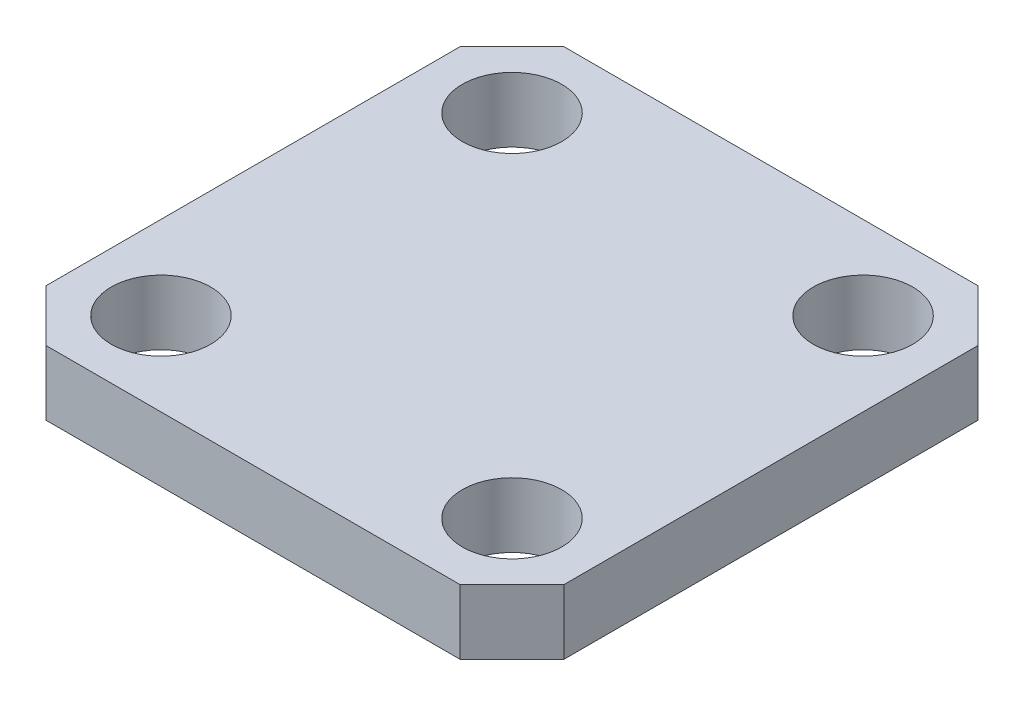
ISO-10303-21;
HEADER;
FILE_DESCRIPTION(('STEP AP214'),'2;1');
FILE_NAME('part.step','',(''),(''),'','','');
FILE_SCHEMA(('AUTOMOTIVE_DESIGN { 1 0 10303 214 1 1 1 1 }'));
ENDSEC;
DATA;
#1=APPLICATION_CONTEXT('core data for automotive mechanical design processes');
#2=APPLICATION_PROTOCOL_DEFINITION('international standard','automotive_design',2000,#1);
#3=PRODUCT_CONTEXT('',#1,'mechanical');
#4=PRODUCT('Part','Part','',(#3));
#5=PRODUCT_RELATED_PRODUCT_CATEGORY('part','',(#4));
#6=PRODUCT_DEFINITION_FORMATION('','',#4);
#7=PRODUCT_DEFINITION_CONTEXT('part definition',#1,'design');
#8=PRODUCT_DEFINITION('design','',#6,#7);
#9=PRODUCT_DEFINITION_SHAPE('','',#8);
#10=(LENGTH_UNIT() NAMED_UNIT(*) SI_UNIT(.MILLI.,.METRE.));
#11=(NAMED_UNIT(*) PLANE_ANGLE_UNIT() SI_UNIT($,.RADIAN.));
#12=(NAMED_UNIT(*) SI_UNIT($,.STERADIAN.) SOLID_ANGLE_UNIT());
#13=UNCERTAINTY_MEASURE_WITH_UNIT(LENGTH_MEASURE(1.E-05),#10,'distance_accuracy_value','');
#14=(GEOMETRIC_REPRESENTATION_CONTEXT(3) GLOBAL_UNCERTAINTY_ASSIGNED_CONTEXT((#13)) GLOBAL_UNIT_ASSIGNED_CONTEXT((#10,
#11,#12)) REPRESENTATION_CONTEXT('',''));
#15=CARTESIAN_POINT('',(0.,0.,0.));
#16=DIRECTION('',(0.,0.,1.));
#17=DIRECTION('',(1.,0.,0.));
#18=AXIS2_PLACEMENT_3D('',#15,#16,#17);
#19=CARTESIAN_POINT('',(6.35,1.5875,-6.35));
#20=DIRECTION('',(-1.,0.,0.));
#21=DIRECTION('',(0.,0.,1.));
#22=AXIS2_PLACEMENT_3D('',#19,#20,#21);
#23=PLANE('',#22);
#24=DIRECTION('',(0.,0.,-1.));
#25=VECTOR('',#24,1.);
#26=CARTESIAN_POINT('',(6.35,1.5875,-6.35));
#27=LINE('',#26,#25);
#28=CARTESIAN_POINT('',(6.35,1.5875,5.08));
#29=VERTEX_POINT('',#28);
#30=CARTESIAN_POINT('',(6.35,1.5875,-5.08));
#31=VERTEX_POINT('',#30);
#32=EDGE_CURVE('E130',#29,#31,#27,.T.);
#33=ORIENTED_EDGE('',*,*,#32,.F.);
#34=DIRECTION('',(0.,-1.,0.));
#35=VECTOR('',#34,1.);
#36=CARTESIAN_POINT('',(6.35,1.5875,5.08));
#37=LINE('',#36,#35);
#38=CARTESIAN_POINT('',(6.35,0.,5.08));
#39=VERTEX_POINT('',#38);
#40=EDGE_CURVE('E156',#29,#39,#37,.T.);
#41=ORIENTED_EDGE('',*,*,#40,.T.);
#42=DIRECTION('',(0.,0.,-1.));
#43=VECTOR('',#42,1.);
#44=CARTESIAN_POINT('',(6.35,0.,-6.35));
#45=LINE('',#44,#43);
#46=CARTESIAN_POINT('',(6.35,0.,-5.08));
#47=VERTEX_POINT('',#46);
#48=EDGE_CURVE('E162',#39,#47,#45,.T.);
#49=ORIENTED_EDGE('',*,*,#48,.T.);
#50=DIRECTION('',(0.,1.,0.));
#51=VECTOR('',#50,1.);
#52=CARTESIAN_POINT('',(6.35,1.5875,-5.08));
#53=LINE('',#52,#51);
#54=EDGE_CURVE('E154',#47,#31,#53,.T.);
#55=ORIENTED_EDGE('',*,*,#54,.T.);
#56=EDGE_LOOP('',(#33,#41,#49,#55));
#57=FACE_BOUND('',#56,.T.);
#58=ADVANCED_FACE('F37',(#57),#23,.F.);
#59=CARTESIAN_POINT('',(-6.35,1.5875,-6.35));
#60=DIRECTION('',(0.,0.,1.));
#61=DIRECTION('',(1.,0.,0.));
#62=AXIS2_PLACEMENT_3D('',#59,#60,#61);
#63=PLANE('',#62);
#64=DIRECTION('',(-1.,0.,0.));
#65=VECTOR('',#64,1.);
#66=CARTESIAN_POINT('',(-6.35,1.5875,-6.35));
#67=LINE('',#66,#65);
#68=CARTESIAN_POINT('',(5.08,1.5875,-6.35));
#69=VERTEX_POINT('',#68);
#70=CARTESIAN_POINT('',(-5.07999999999999,1.5875,-6.35));
#71=VERTEX_POINT('',#70);
#72=EDGE_CURVE('E133',#69,#71,#67,.T.);
#73=ORIENTED_EDGE('',*,*,#72,.F.);
#74=DIRECTION('',(0.,-1.,0.));
#75=VECTOR('',#74,1.);
#76=CARTESIAN_POINT('',(5.08,1.5875,-6.35));
#77=LINE('',#76,#75);
#78=CARTESIAN_POINT('',(5.08,0.,-6.35));
#79=VERTEX_POINT('',#78);
#80=EDGE_CURVE('E11',#69,#79,#77,.T.);
#81=ORIENTED_EDGE('',*,*,#80,.T.);
#82=DIRECTION('',(-1.,0.,0.));
#83=VECTOR('',#82,1.);
#84=CARTESIAN_POINT('',(-6.35,0.,-6.35));
#85=LINE('',#84,#83);
#86=CARTESIAN_POINT('',(-5.07999999999999,0.,-6.35));
#87=VERTEX_POINT('',#86);
#88=EDGE_CURVE('E135',#79,#87,#85,.T.);
#89=ORIENTED_EDGE('',*,*,#88,.T.);
#90=DIRECTION('',(0.,1.,0.));
#91=VECTOR('',#90,1.);
#92=CARTESIAN_POINT('',(-5.07999999999999,1.5875,-6.35));
#93=LINE('',#92,#91);
#94=EDGE_CURVE('E46',#87,#71,#93,.T.);
#95=ORIENTED_EDGE('',*,*,#94,.T.);
#96=EDGE_LOOP('',(#73,#81,#89,#95));
#97=FACE_BOUND('',#96,.T.);
#98=ADVANCED_FACE('F218',(#97),#63,.F.);
#99=CARTESIAN_POINT('',(-6.35,1.5875,-6.35));
#100=DIRECTION('',(1.,0.,0.));
#101=DIRECTION('',(0.,0.,-1.));
#102=AXIS2_PLACEMENT_3D('',#99,#100,#101);
#103=PLANE('',#102);
#104=DIRECTION('',(0.,0.,1.));
#105=VECTOR('',#104,1.);
#106=CARTESIAN_POINT('',(-6.35,0.,-6.35));
#107=LINE('',#106,#105);
#108=CARTESIAN_POINT('',(-6.35,0.,-5.08));
#109=VERTEX_POINT('',#108);
#110=CARTESIAN_POINT('',(-6.35,0.,5.07999999999999));
#111=VERTEX_POINT('',#110);
#112=EDGE_CURVE('E131',#109,#111,#107,.T.);
#113=ORIENTED_EDGE('',*,*,#112,.T.);
#114=DIRECTION('',(0.,1.,0.));
#115=VECTOR('',#114,1.);
#116=CARTESIAN_POINT('',(-6.35,1.5875,5.07999999999999));
#117=LINE('',#116,#115);
#118=CARTESIAN_POINT('',(-6.35,1.5875,5.07999999999999));
#119=VERTEX_POINT('',#118);
#120=EDGE_CURVE('E109',#111,#119,#117,.T.);
#121=ORIENTED_EDGE('',*,*,#120,.T.);
#122=DIRECTION('',(0.,0.,1.));
#123=VECTOR('',#122,1.);
#124=CARTESIAN_POINT('',(-6.35,1.5875,-6.35));
#125=LINE('',#124,#123);
#126=CARTESIAN_POINT('',(-6.35,1.5875,-5.08));
#127=VERTEX_POINT('',#126);
#128=EDGE_CURVE('E174',#127,#119,#125,.T.);
#129=ORIENTED_EDGE('',*,*,#128,.F.);
#130=DIRECTION('',(0.,-1.,0.));
#131=VECTOR('',#130,1.);
#132=CARTESIAN_POINT('',(-6.35,1.5875,-5.08));
#133=LINE('',#132,#131);
#134=EDGE_CURVE('E114',#127,#109,#133,.T.);
#135=ORIENTED_EDGE('',*,*,#134,.T.);
#136=EDGE_LOOP('',(#113,#121,#129,#135));
#137=FACE_BOUND('',#136,.T.);
#138=ADVANCED_FACE('F216',(#137),#103,.F.);
#139=CARTESIAN_POINT('',(-6.35,1.5875,6.35));
#140=DIRECTION('',(0.,0.,-1.));
#141=DIRECTION('',(-1.,0.,0.));
#142=AXIS2_PLACEMENT_3D('',#139,#140,#141);
#143=PLANE('',#142);
#144=DIRECTION('',(1.,0.,0.));
#145=VECTOR('',#144,1.);
#146=CARTESIAN_POINT('',(-6.35,1.5875,6.35));
#147=LINE('',#146,#145);
#148=CARTESIAN_POINT('',(-5.08,1.5875,6.35));
#149=VERTEX_POINT('',#148);
#150=CARTESIAN_POINT('',(5.07999999999999,1.5875,6.35));
#151=VERTEX_POINT('',#150);
#152=EDGE_CURVE('E124',#149,#151,#147,.T.);
#153=ORIENTED_EDGE('',*,*,#152,.F.);
#154=DIRECTION('',(0.,-1.,0.));
#155=VECTOR('',#154,1.);
#156=CARTESIAN_POINT('',(-5.08,1.5875,6.35));
#157=LINE('',#156,#155);
#158=CARTESIAN_POINT('',(-5.08,0.,6.35));
#159=VERTEX_POINT('',#158);
#160=EDGE_CURVE('E108',#149,#159,#157,.T.);
#161=ORIENTED_EDGE('',*,*,#160,.T.);
#162=DIRECTION('',(1.,0.,0.));
#163=VECTOR('',#162,1.);
#164=CARTESIAN_POINT('',(-6.35,0.,6.35));
#165=LINE('',#164,#163);
#166=CARTESIAN_POINT('',(5.07999999999999,0.,6.35));
#167=VERTEX_POINT('',#166);
#168=EDGE_CURVE('E121',#159,#167,#165,.T.);
#169=ORIENTED_EDGE('',*,*,#168,.T.);
#170=DIRECTION('',(0.,1.,0.));
#171=VECTOR('',#170,1.);
#172=CARTESIAN_POINT('',(5.07999999999999,1.5875,6.35));
#173=LINE('',#172,#171);
#174=EDGE_CURVE('E126',#167,#151,#173,.T.);
#175=ORIENTED_EDGE('',*,*,#174,.T.);
#176=EDGE_LOOP('',(#153,#161,#169,#175));
#177=FACE_BOUND('',#176,.T.);
#178=ADVANCED_FACE('F120',(#177),#143,.F.);
#179=CARTESIAN_POINT('',(0.,1.5875,0.));
#180=DIRECTION('',(0.,1.,0.));
#181=DIRECTION('',(0.,0.,1.));
#182=AXIS2_PLACEMENT_3D('',#179,#180,#181);
#183=PLANE('',#182);
#184=CARTESIAN_POINT('',(-4.3053,1.5875,-4.3053));
#185=DIRECTION('',(0.,1.,0.));
#186=DIRECTION('',(0.,0.,1.));
#187=AXIS2_PLACEMENT_3D('',#184,#185,#186);
#188=CIRCLE('',#187,1.21919999999999);
#189=CARTESIAN_POINT('',(-4.3053,1.5875,-3.08610000000001));
#190=VERTEX_POINT('',#189);
#191=EDGE_CURVE('E196',#190,#190,#188,.T.);
#192=ORIENTED_EDGE('',*,*,#191,.F.);
#193=EDGE_LOOP('',(#192));
#194=FACE_BOUND('',#193,.T.);
#195=CARTESIAN_POINT('',(4.3053,1.5875,-4.3053));
#196=DIRECTION('',(0.,1.,0.));
#197=DIRECTION('',(0.,0.,1.));
#198=AXIS2_PLACEMENT_3D('',#195,#196,#197);
#199=CIRCLE('',#198,1.21919999999999);
#200=CARTESIAN_POINT('',(4.3053,1.5875,-3.08610000000001));
#201=VERTEX_POINT('',#200);
#202=EDGE_CURVE('E189',#201,#201,#199,.T.);
#203=ORIENTED_EDGE('',*,*,#202,.F.);
#204=EDGE_LOOP('',(#203));
#205=FACE_BOUND('',#204,.T.);
#206=CARTESIAN_POINT('',(4.3053,1.5875,4.3053));
#207=DIRECTION('',(0.,1.,0.));
#208=DIRECTION('',(0.,0.,1.));
#209=AXIS2_PLACEMENT_3D('',#206,#207,#208);
#210=CIRCLE('',#209,1.21919999999999);
#211=CARTESIAN_POINT('',(4.3053,1.5875,5.52449999999999));
#212=VERTEX_POINT('',#211);
#213=EDGE_CURVE('E183',#212,#212,#210,.T.);
#214=ORIENTED_EDGE('',*,*,#213,.F.);
#215=EDGE_LOOP('',(#214));
#216=FACE_BOUND('',#215,.T.);
#217=CARTESIAN_POINT('',(-4.3053,1.5875,4.3053));
#218=DIRECTION('',(0.,1.,0.));
#219=DIRECTION('',(0.,0.,1.));
#220=AXIS2_PLACEMENT_3D('',#217,#218,#219);
#221=CIRCLE('',#220,1.21919999999999);
#222=CARTESIAN_POINT('',(-4.3053,1.5875,5.52449999999999));
#223=VERTEX_POINT('',#222);
#224=EDGE_CURVE('E170',#223,#223,#221,.T.);
#225=ORIENTED_EDGE('',*,*,#224,.F.);
#226=EDGE_LOOP('',(#225));
#227=FACE_BOUND('',#226,.T.);
#228=ORIENTED_EDGE('',*,*,#128,.T.);
#229=DIRECTION('',(-0.707106781186546,0.,-0.707106781186549));
#230=VECTOR('',#229,1.);
#231=CARTESIAN_POINT('',(-5.71500000000001,1.5875,5.71499999999999));
#232=LINE('',#231,#230);
#233=EDGE_CURVE('E152',#119,#149,#232,.F.);
#234=ORIENTED_EDGE('',*,*,#233,.T.);
#235=ORIENTED_EDGE('',*,*,#152,.T.);
#236=DIRECTION('',(-0.707106781186549,0.,0.707106781186546));
#237=VECTOR('',#236,1.);
#238=CARTESIAN_POINT('',(5.71499999999999,1.5875,5.71500000000001));
#239=LINE('',#238,#237);
#240=EDGE_CURVE('E150',#151,#29,#239,.F.);
#241=ORIENTED_EDGE('',*,*,#240,.T.);
#242=ORIENTED_EDGE('',*,*,#32,.T.);
#243=DIRECTION('',(0.707106781186547,0.,0.707106781186548));
#244=VECTOR('',#243,1.);
#245=CARTESIAN_POINT('',(5.71500000000001,1.5875,-5.71499999999999));
#246=LINE('',#245,#244);
#247=EDGE_CURVE('E59',#31,#69,#246,.F.);
#248=ORIENTED_EDGE('',*,*,#247,.T.);
#249=ORIENTED_EDGE('',*,*,#72,.T.);
#250=DIRECTION('',(0.707106781186549,0.,-0.707106781186546));
#251=VECTOR('',#250,1.);
#252=CARTESIAN_POINT('',(-5.71499999999999,1.5875,-5.71500000000001));
#253=LINE('',#252,#251);
#254=EDGE_CURVE('E147',#71,#127,#253,.F.);
#255=ORIENTED_EDGE('',*,*,#254,.T.);
#256=EDGE_LOOP('',(#228,#234,#235,#241,#242,#248,#249,#255));
#257=FACE_BOUND('',#256,.T.);
#258=ADVANCED_FACE('F203',(#194,#205,#216,#227,#257),#183,.T.);
#259=CARTESIAN_POINT('',(0.,0.,0.));
#260=DIRECTION('',(0.,1.,0.));
#261=DIRECTION('',(0.,0.,1.));
#262=AXIS2_PLACEMENT_3D('',#259,#260,#261);
#263=PLANE('',#262);
#264=CARTESIAN_POINT('',(-4.3053,0.,-4.3053));
#265=DIRECTION('',(0.,1.,0.));
#266=DIRECTION('',(0.,0.,1.));
#267=AXIS2_PLACEMENT_3D('',#264,#265,#266);
#268=CIRCLE('',#267,1.21919999999999);
#269=CARTESIAN_POINT('',(-4.3053,0.,-3.08610000000001));
#270=VERTEX_POINT('',#269);
#271=EDGE_CURVE('E192',#270,#270,#268,.T.);
#272=ORIENTED_EDGE('',*,*,#271,.T.);
#273=EDGE_LOOP('',(#272));
#274=FACE_BOUND('',#273,.T.);
#275=CARTESIAN_POINT('',(4.3053,0.,-4.3053));
#276=DIRECTION('',(0.,1.,0.));
#277=DIRECTION('',(0.,0.,1.));
#278=AXIS2_PLACEMENT_3D('',#275,#276,#277);
#279=CIRCLE('',#278,1.21919999999999);
#280=CARTESIAN_POINT('',(4.3053,0.,-3.08610000000001));
#281=VERTEX_POINT('',#280);
#282=EDGE_CURVE('E186',#281,#281,#279,.T.);
#283=ORIENTED_EDGE('',*,*,#282,.T.);
#284=EDGE_LOOP('',(#283));
#285=FACE_BOUND('',#284,.T.);
#286=CARTESIAN_POINT('',(4.3053,0.,4.3053));
#287=DIRECTION('',(0.,1.,0.));
#288=DIRECTION('',(0.,0.,1.));
#289=AXIS2_PLACEMENT_3D('',#286,#287,#288);
#290=CIRCLE('',#289,1.21919999999999);
#291=CARTESIAN_POINT('',(4.3053,0.,5.52449999999999));
#292=VERTEX_POINT('',#291);
#293=EDGE_CURVE('E180',#292,#292,#290,.T.);
#294=ORIENTED_EDGE('',*,*,#293,.T.);
#295=EDGE_LOOP('',(#294));
#296=FACE_BOUND('',#295,.T.);
#297=CARTESIAN_POINT('',(-4.3053,0.,4.3053));
#298=DIRECTION('',(0.,1.,0.));
#299=DIRECTION('',(0.,0.,1.));
#300=AXIS2_PLACEMENT_3D('',#297,#298,#299);
#301=CIRCLE('',#300,1.21919999999999);
#302=CARTESIAN_POINT('',(-4.3053,0.,5.52449999999999));
#303=VERTEX_POINT('',#302);
#304=EDGE_CURVE('E167',#303,#303,#301,.T.);
#305=ORIENTED_EDGE('',*,*,#304,.T.);
#306=EDGE_LOOP('',(#305));
#307=FACE_BOUND('',#306,.T.);
#308=ORIENTED_EDGE('',*,*,#168,.F.);
#309=DIRECTION('',(0.707106781186546,0.,0.707106781186549));
#310=VECTOR('',#309,1.);
#311=CARTESIAN_POINT('',(-5.08,0.,6.35));
#312=LINE('',#311,#310);
#313=EDGE_CURVE('E104',#159,#111,#312,.F.);
#314=ORIENTED_EDGE('',*,*,#313,.T.);
#315=ORIENTED_EDGE('',*,*,#112,.F.);
#316=DIRECTION('',(-0.707106781186549,0.,0.707106781186546));
#317=VECTOR('',#316,1.);
#318=CARTESIAN_POINT('',(-6.35,0.,-5.08));
#319=LINE('',#318,#317);
#320=EDGE_CURVE('E125',#109,#87,#319,.F.);
#321=ORIENTED_EDGE('',*,*,#320,.T.);
#322=ORIENTED_EDGE('',*,*,#88,.F.);
#323=DIRECTION('',(-0.707106781186547,0.,-0.707106781186548));
#324=VECTOR('',#323,1.);
#325=CARTESIAN_POINT('',(5.08,0.,-6.35));
#326=LINE('',#325,#324);
#327=EDGE_CURVE('E141',#79,#47,#326,.F.);
#328=ORIENTED_EDGE('',*,*,#327,.T.);
#329=ORIENTED_EDGE('',*,*,#48,.F.);
#330=DIRECTION('',(0.707106781186549,0.,-0.707106781186546));
#331=VECTOR('',#330,1.);
#332=CARTESIAN_POINT('',(6.35,0.,5.08));
#333=LINE('',#332,#331);
#334=EDGE_CURVE('E115',#39,#167,#333,.F.);
#335=ORIENTED_EDGE('',*,*,#334,.T.);
#336=EDGE_LOOP('',(#308,#314,#315,#321,#322,#328,#329,#335));
#337=FACE_BOUND('',#336,.T.);
#338=ADVANCED_FACE('F128',(#274,#285,#296,#307,#337),#263,.F.);
#339=CARTESIAN_POINT('',(-4.3053,1.5875,4.3053));
#340=DIRECTION('',(0.,1.,0.));
#341=DIRECTION('',(0.,0.,1.));
#342=AXIS2_PLACEMENT_3D('',#339,#340,#341);
#343=CYLINDRICAL_SURFACE('',#342,1.21919999999999);
#344=ORIENTED_EDGE('',*,*,#304,.F.);
#345=EDGE_LOOP('',(#344));
#346=FACE_BOUND('',#345,.T.);
#347=ORIENTED_EDGE('',*,*,#224,.T.);
#348=EDGE_LOOP('',(#347));
#349=FACE_BOUND('',#348,.T.);
#350=ADVANCED_FACE('F253',(#346,#349),#343,.F.);
#351=CARTESIAN_POINT('',(4.3053,1.5875,4.3053));
#352=DIRECTION('',(0.,1.,0.));
#353=DIRECTION('',(0.,0.,1.));
#354=AXIS2_PLACEMENT_3D('',#351,#352,#353);
#355=CYLINDRICAL_SURFACE('',#354,1.21919999999999);
#356=ORIENTED_EDGE('',*,*,#293,.F.);
#357=EDGE_LOOP('',(#356));
#358=FACE_BOUND('',#357,.T.);
#359=ORIENTED_EDGE('',*,*,#213,.T.);
#360=EDGE_LOOP('',(#359));
#361=FACE_BOUND('',#360,.T.);
#362=ADVANCED_FACE('F258',(#358,#361),#355,.F.);
#363=CARTESIAN_POINT('',(4.3053,1.5875,-4.3053));
#364=DIRECTION('',(0.,1.,0.));
#365=DIRECTION('',(0.,0.,1.));
#366=AXIS2_PLACEMENT_3D('',#363,#364,#365);
#367=CYLINDRICAL_SURFACE('',#366,1.21919999999999);
#368=ORIENTED_EDGE('',*,*,#282,.F.);
#369=EDGE_LOOP('',(#368));
#370=FACE_BOUND('',#369,.T.);
#371=ORIENTED_EDGE('',*,*,#202,.T.);
#372=EDGE_LOOP('',(#371));
#373=FACE_BOUND('',#372,.T.);
#374=ADVANCED_FACE('F262',(#370,#373),#367,.F.);
#375=CARTESIAN_POINT('',(-4.3053,1.5875,-4.3053));
#376=DIRECTION('',(0.,1.,0.));
#377=DIRECTION('',(0.,0.,1.));
#378=AXIS2_PLACEMENT_3D('',#375,#376,#377);
#379=CYLINDRICAL_SURFACE('',#378,1.21919999999999);
#380=ORIENTED_EDGE('',*,*,#271,.F.);
#381=EDGE_LOOP('',(#380));
#382=FACE_BOUND('',#381,.T.);
#383=ORIENTED_EDGE('',*,*,#191,.T.);
#384=EDGE_LOOP('',(#383));
#385=FACE_BOUND('',#384,.T.);
#386=ADVANCED_FACE('F201',(#382,#385),#379,.F.);
#387=CARTESIAN_POINT('',(-5.08,1.5875,6.35));
#388=DIRECTION('',(0.707106781186549,0.,-0.707106781186546));
#389=DIRECTION('',(0.,-1.,0.));
#390=AXIS2_PLACEMENT_3D('',#387,#388,#389);
#391=PLANE('',#390);
#392=ORIENTED_EDGE('',*,*,#233,.F.);
#393=ORIENTED_EDGE('',*,*,#120,.F.);
#394=ORIENTED_EDGE('',*,*,#313,.F.);
#395=ORIENTED_EDGE('',*,*,#160,.F.);
#396=EDGE_LOOP('',(#392,#393,#394,#395));
#397=FACE_BOUND('',#396,.T.);
#398=ADVANCED_FACE('F107',(#397),#391,.F.);
#399=CARTESIAN_POINT('',(6.35,1.5875,5.08));
#400=DIRECTION('',(-0.707106781186546,0.,-0.707106781186549));
#401=DIRECTION('',(0.,-1.,0.));
#402=AXIS2_PLACEMENT_3D('',#399,#400,#401);
#403=PLANE('',#402);
#404=ORIENTED_EDGE('',*,*,#240,.F.);
#405=ORIENTED_EDGE('',*,*,#174,.F.);
#406=ORIENTED_EDGE('',*,*,#334,.F.);
#407=ORIENTED_EDGE('',*,*,#40,.F.);
#408=EDGE_LOOP('',(#404,#405,#406,#407));
#409=FACE_BOUND('',#408,.T.);
#410=ADVANCED_FACE('F222',(#409),#403,.F.);
#411=CARTESIAN_POINT('',(5.08,1.5875,-6.35));
#412=DIRECTION('',(-0.707106781186548,0.,0.707106781186547));
#413=DIRECTION('',(0.,-1.,0.));
#414=AXIS2_PLACEMENT_3D('',#411,#412,#413);
#415=PLANE('',#414);
#416=ORIENTED_EDGE('',*,*,#247,.F.);
#417=ORIENTED_EDGE('',*,*,#54,.F.);
#418=ORIENTED_EDGE('',*,*,#327,.F.);
#419=ORIENTED_EDGE('',*,*,#80,.F.);
#420=EDGE_LOOP('',(#416,#417,#418,#419));
#421=FACE_BOUND('',#420,.T.);
#422=ADVANCED_FACE('F221',(#421),#415,.F.);
#423=CARTESIAN_POINT('',(-6.35,1.5875,-5.08));
#424=DIRECTION('',(0.707106781186546,0.,0.707106781186549));
#425=DIRECTION('',(0.,-1.,0.));
#426=AXIS2_PLACEMENT_3D('',#423,#424,#425);
#427=PLANE('',#426);
#428=ORIENTED_EDGE('',*,*,#254,.F.);
#429=ORIENTED_EDGE('',*,*,#94,.F.);
#430=ORIENTED_EDGE('',*,*,#320,.F.);
#431=ORIENTED_EDGE('',*,*,#134,.F.);
#432=EDGE_LOOP('',(#428,#429,#430,#431));
#433=FACE_BOUND('',#432,.T.);
#434=ADVANCED_FACE('F40',(#433),#427,.F.);
#435=CLOSED_SHELL('',(#58,#98,#138,#178,#258,#338,#350,#362,#374,#386,#398,#410,#422,#434));
#436=MANIFOLD_SOLID_BREP('B2',#435);
#437=ADVANCED_BREP_SHAPE_REPRESENTATION('',(#18,#436),#14);
#438=SHAPE_DEFINITION_REPRESENTATION(#9,#437);
ENDSEC;
END-ISO-10303-21;
